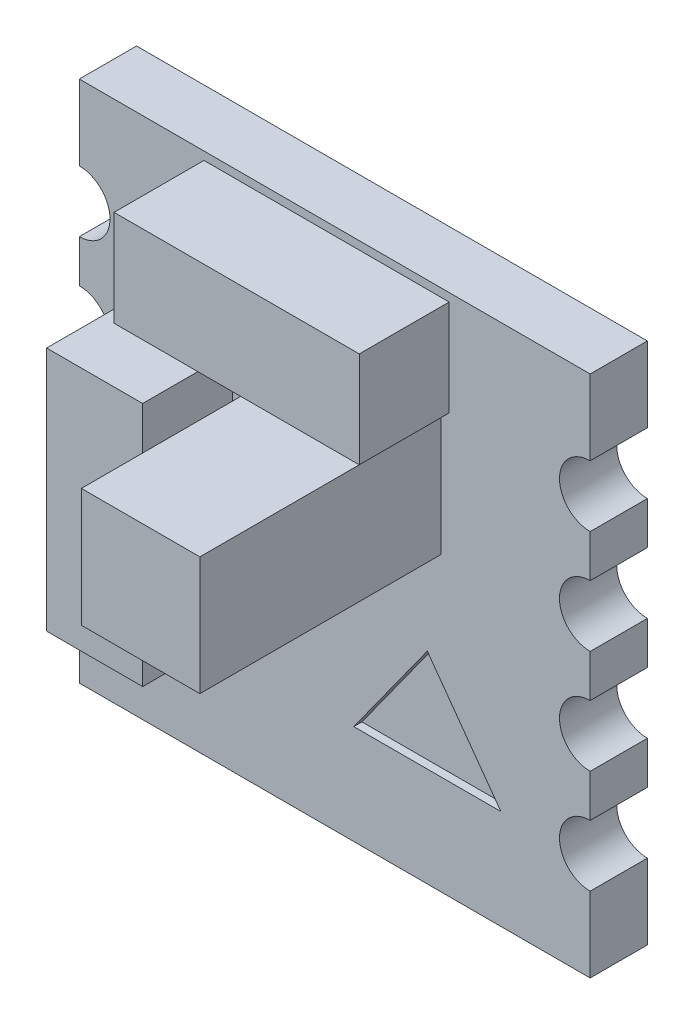
ISO-10303-21;
HEADER;
FILE_DESCRIPTION(('STEP AP214'),'2;1');
FILE_NAME('part.step','',(''),(''),'','','');
FILE_SCHEMA(('AUTOMOTIVE_DESIGN { 1 0 10303 214 1 1 1 1 }'));
ENDSEC;
DATA;
#1=APPLICATION_CONTEXT('core data for automotive mechanical design processes');
#2=APPLICATION_PROTOCOL_DEFINITION('international standard','automotive_design',2000,#1);
#3=PRODUCT_CONTEXT('',#1,'mechanical');
#4=PRODUCT('Part','Part','',(#3));
#5=PRODUCT_RELATED_PRODUCT_CATEGORY('part','',(#4));
#6=PRODUCT_DEFINITION_FORMATION('','',#4);
#7=PRODUCT_DEFINITION_CONTEXT('part definition',#1,'design');
#8=PRODUCT_DEFINITION('design','',#6,#7);
#9=PRODUCT_DEFINITION_SHAPE('','',#8);
#10=(LENGTH_UNIT() NAMED_UNIT(*) SI_UNIT(.MILLI.,.METRE.));
#11=(NAMED_UNIT(*) PLANE_ANGLE_UNIT() SI_UNIT($,.RADIAN.));
#12=(NAMED_UNIT(*) SI_UNIT($,.STERADIAN.) SOLID_ANGLE_UNIT());
#13=UNCERTAINTY_MEASURE_WITH_UNIT(LENGTH_MEASURE(1.E-05),#10,'distance_accuracy_value','');
#14=(GEOMETRIC_REPRESENTATION_CONTEXT(3) GLOBAL_UNCERTAINTY_ASSIGNED_CONTEXT((#13)) GLOBAL_UNIT_ASSIGNED_CONTEXT((#10,
#11,#12)) REPRESENTATION_CONTEXT('',''));
#15=CARTESIAN_POINT('',(0.,0.,0.));
#16=DIRECTION('',(0.,0.,1.));
#17=DIRECTION('',(1.,0.,0.));
#18=AXIS2_PLACEMENT_3D('',#15,#16,#17);
#19=CARTESIAN_POINT('',(0.,0.,0.7));
#20=DIRECTION('',(0.,0.,1.));
#21=DIRECTION('',(1.,0.,0.));
#22=AXIS2_PLACEMENT_3D('',#19,#20,#21);
#23=PLANE('',#22);
#24=DIRECTION('',(1.,0.,0.));
#25=VECTOR('',#24,1.);
#26=CARTESIAN_POINT('',(0.,-3.96497068329436,0.7));
#27=LINE('',#26,#25);
#28=CARTESIAN_POINT('',(0.465361390122973,-3.96497068329436,0.7));
#29=VERTEX_POINT('',#28);
#30=CARTESIAN_POINT('',(4.06536139012297,-3.96497068329436,0.7));
#31=VERTEX_POINT('',#30);
#32=EDGE_CURVE('E55',#29,#31,#27,.T.);
#33=ORIENTED_EDGE('',*,*,#32,.F.);
#34=DIRECTION('',(-0.584304725845076,-0.811534341451494,0.));
#35=VECTOR('',#34,1.);
#36=CARTESIAN_POINT('',(2.18660450612152,-1.57435524440749,0.7));
#37=LINE('',#36,#35);
#38=CARTESIAN_POINT('',(2.26536139012297,-1.46497068329436,0.7));
#39=VERTEX_POINT('',#38);
#40=EDGE_CURVE('E284',#39,#29,#37,.T.);
#41=ORIENTED_EDGE('',*,*,#40,.F.);
#42=DIRECTION('',(0.584304725845076,-0.811534341451495,0.));
#43=VECTOR('',#42,1.);
#44=CARTESIAN_POINT('',(0.797275090984612,0.574038065508921,0.7));
#45=LINE('',#44,#43);
#46=EDGE_CURVE('E287',#39,#31,#45,.T.);
#47=ORIENTED_EDGE('',*,*,#46,.T.);
#48=EDGE_LOOP('',(#33,#41,#47));
#49=FACE_BOUND('',#48,.T.);
#50=DIRECTION('',(0.,1.,0.));
#51=VECTOR('',#50,1.);
#52=CARTESIAN_POINT('',(2.8,6.2,0.7));
#53=LINE('',#52,#51);
#54=CARTESIAN_POINT('',(2.8,3.85,0.7));
#55=VERTEX_POINT('',#54);
#56=CARTESIAN_POINT('',(2.8,6.2,0.7));
#57=VERTEX_POINT('',#56);
#58=EDGE_CURVE('E355',#55,#57,#53,.T.);
#59=ORIENTED_EDGE('',*,*,#58,.F.);
#60=DIRECTION('',(1.,0.,0.));
#61=VECTOR('',#60,1.);
#62=CARTESIAN_POINT('',(-3.2,3.85,0.7));
#63=LINE('',#62,#61);
#64=CARTESIAN_POINT('',(-3.2,3.85,0.7));
#65=VERTEX_POINT('',#64);
#66=EDGE_CURVE('E360',#65,#55,#63,.T.);
#67=ORIENTED_EDGE('',*,*,#66,.F.);
#68=DIRECTION('',(0.,-1.,0.));
#69=VECTOR('',#68,1.);
#70=CARTESIAN_POINT('',(-3.2,6.2,0.7));
#71=LINE('',#70,#69);
#72=CARTESIAN_POINT('',(-3.2,6.2,0.7));
#73=VERTEX_POINT('',#72);
#74=EDGE_CURVE('E372',#73,#65,#71,.T.);
#75=ORIENTED_EDGE('',*,*,#74,.F.);
#76=DIRECTION('',(-1.,0.,0.));
#77=VECTOR('',#76,1.);
#78=CARTESIAN_POINT('',(-3.2,6.2,0.7));
#79=LINE('',#78,#77);
#80=EDGE_CURVE('E369',#57,#73,#79,.T.);
#81=ORIENTED_EDGE('',*,*,#80,.F.);
#82=EDGE_LOOP('',(#59,#67,#75,#81));
#83=FACE_BOUND('',#82,.T.);
#84=CARTESIAN_POINT('',(-6.25,3.81,0.7));
#85=DIRECTION('',(0.,0.,1.));
#86=DIRECTION('',(1.,0.,0.));
#87=AXIS2_PLACEMENT_3D('',#84,#85,#86);
#88=CIRCLE('',#87,0.749999999999999);
#89=CARTESIAN_POINT('',(-6.25,3.06,0.7));
#90=VERTEX_POINT('',#89);
#91=CARTESIAN_POINT('',(-6.25,4.56,0.7));
#92=VERTEX_POINT('',#91);
#93=EDGE_CURVE('E398',#90,#92,#88,.T.);
#94=ORIENTED_EDGE('',*,*,#93,.F.);
#95=DIRECTION('',(0.,-1.,0.));
#96=VECTOR('',#95,1.);
#97=CARTESIAN_POINT('',(-6.25,6.4,0.7));
#98=LINE('',#97,#96);
#99=CARTESIAN_POINT('',(-6.25,2.02,0.7));
#100=VERTEX_POINT('',#99);
#101=EDGE_CURVE('E477',#90,#100,#98,.T.);
#102=ORIENTED_EDGE('',*,*,#101,.T.);
#103=CARTESIAN_POINT('',(-6.25,1.27,0.7));
#104=DIRECTION('',(0.,0.,1.));
#105=DIRECTION('',(1.,0.,0.));
#106=AXIS2_PLACEMENT_3D('',#103,#104,#105);
#107=CIRCLE('',#106,0.749999999999999);
#108=CARTESIAN_POINT('',(-6.25,0.520000000000001,0.7));
#109=VERTEX_POINT('',#108);
#110=EDGE_CURVE('E400',#109,#100,#107,.T.);
#111=ORIENTED_EDGE('',*,*,#110,.F.);
#112=CARTESIAN_POINT('',(-6.25,-0.520000000000004,0.7));
#113=VERTEX_POINT('',#112);
#114=EDGE_CURVE('E587',#109,#113,#98,.T.);
#115=ORIENTED_EDGE('',*,*,#114,.T.);
#116=CARTESIAN_POINT('',(-6.25,-1.27,0.7));
#117=DIRECTION('',(0.,0.,1.));
#118=DIRECTION('',(-1.,0.,0.));
#119=AXIS2_PLACEMENT_3D('',#116,#117,#118);
#120=CIRCLE('',#119,0.749999999999999);
#121=CARTESIAN_POINT('',(-6.25,-2.02,0.7));
#122=VERTEX_POINT('',#121);
#123=EDGE_CURVE('E402',#122,#113,#120,.T.);
#124=ORIENTED_EDGE('',*,*,#123,.F.);
#125=CARTESIAN_POINT('',(-6.25,-3.06,0.7));
#126=VERTEX_POINT('',#125);
#127=EDGE_CURVE('E589',#122,#126,#98,.T.);
#128=ORIENTED_EDGE('',*,*,#127,.T.);
#129=CARTESIAN_POINT('',(-6.24999999999999,-3.81,0.7));
#130=DIRECTION('',(0.,0.,1.));
#131=DIRECTION('',(-1.,0.,0.));
#132=AXIS2_PLACEMENT_3D('',#129,#130,#131);
#133=CIRCLE('',#132,0.749999999999999);
#134=CARTESIAN_POINT('',(-6.25,-4.56,0.7));
#135=VERTEX_POINT('',#134);
#136=EDGE_CURVE('E407',#135,#126,#133,.T.);
#137=ORIENTED_EDGE('',*,*,#136,.F.);
#138=CARTESIAN_POINT('',(-6.25,-6.4,0.7));
#139=VERTEX_POINT('',#138);
#140=EDGE_CURVE('E472',#135,#139,#98,.T.);
#141=ORIENTED_EDGE('',*,*,#140,.T.);
#142=DIRECTION('',(1.,0.,0.));
#143=VECTOR('',#142,1.);
#144=CARTESIAN_POINT('',(-6.25,-6.4,0.7));
#145=LINE('',#144,#143);
#146=CARTESIAN_POINT('',(6.25,-6.4,0.7));
#147=VERTEX_POINT('',#146);
#148=EDGE_CURVE('E476',#139,#147,#145,.T.);
#149=ORIENTED_EDGE('',*,*,#148,.T.);
#150=DIRECTION('',(0.,1.,0.));
#151=VECTOR('',#150,1.);
#152=CARTESIAN_POINT('',(6.25,6.4,0.7));
#153=LINE('',#152,#151);
#154=CARTESIAN_POINT('',(6.25,-4.56,0.7));
#155=VERTEX_POINT('',#154);
#156=EDGE_CURVE('E465',#147,#155,#153,.T.);
#157=ORIENTED_EDGE('',*,*,#156,.T.);
#158=CARTESIAN_POINT('',(6.24999999999999,-3.81,0.7));
#159=DIRECTION('',(0.,0.,1.));
#160=DIRECTION('',(1.,0.,0.));
#161=AXIS2_PLACEMENT_3D('',#158,#159,#160);
#162=CIRCLE('',#161,0.749999999999999);
#163=CARTESIAN_POINT('',(6.25,-3.06,0.7));
#164=VERTEX_POINT('',#163);
#165=EDGE_CURVE('E396',#164,#155,#162,.T.);
#166=ORIENTED_EDGE('',*,*,#165,.F.);
#167=CARTESIAN_POINT('',(6.25,-2.02,0.7));
#168=VERTEX_POINT('',#167);
#169=EDGE_CURVE('E469',#164,#168,#153,.T.);
#170=ORIENTED_EDGE('',*,*,#169,.T.);
#171=CARTESIAN_POINT('',(6.25,-1.27,0.7));
#172=DIRECTION('',(0.,0.,1.));
#173=DIRECTION('',(1.,0.,0.));
#174=AXIS2_PLACEMENT_3D('',#171,#172,#173);
#175=CIRCLE('',#174,0.749999999999999);
#176=CARTESIAN_POINT('',(6.25,-0.520000000000004,0.7));
#177=VERTEX_POINT('',#176);
#178=EDGE_CURVE('E391',#177,#168,#175,.T.);
#179=ORIENTED_EDGE('',*,*,#178,.F.);
#180=CARTESIAN_POINT('',(6.25,0.520000000000001,0.7));
#181=VERTEX_POINT('',#180);
#182=EDGE_CURVE('E543',#177,#181,#153,.T.);
#183=ORIENTED_EDGE('',*,*,#182,.T.);
#184=CARTESIAN_POINT('',(6.25,1.27,0.7));
#185=DIRECTION('',(0.,0.,1.));
#186=DIRECTION('',(-1.,0.,0.));
#187=AXIS2_PLACEMENT_3D('',#184,#185,#186);
#188=CIRCLE('',#187,0.749999999999999);
#189=CARTESIAN_POINT('',(6.25,2.02,0.7));
#190=VERTEX_POINT('',#189);
#191=EDGE_CURVE('E388',#190,#181,#188,.T.);
#192=ORIENTED_EDGE('',*,*,#191,.F.);
#193=CARTESIAN_POINT('',(6.25,3.06,0.7));
#194=VERTEX_POINT('',#193);
#195=EDGE_CURVE('E542',#190,#194,#153,.T.);
#196=ORIENTED_EDGE('',*,*,#195,.T.);
#197=CARTESIAN_POINT('',(6.25,3.81,0.7));
#198=DIRECTION('',(0.,0.,1.));
#199=DIRECTION('',(-1.,0.,0.));
#200=AXIS2_PLACEMENT_3D('',#197,#198,#199);
#201=CIRCLE('',#200,0.749999999999999);
#202=CARTESIAN_POINT('',(6.25,4.56,0.7));
#203=VERTEX_POINT('',#202);
#204=EDGE_CURVE('E390',#203,#194,#201,.T.);
#205=ORIENTED_EDGE('',*,*,#204,.F.);
#206=CARTESIAN_POINT('',(6.25,6.4,0.7));
#207=VERTEX_POINT('',#206);
#208=EDGE_CURVE('E470',#203,#207,#153,.T.);
#209=ORIENTED_EDGE('',*,*,#208,.T.);
#210=DIRECTION('',(-1.,0.,0.));
#211=VECTOR('',#210,1.);
#212=CARTESIAN_POINT('',(-6.25,6.4,0.7));
#213=LINE('',#212,#211);
#214=CARTESIAN_POINT('',(-6.25,6.4,0.7));
#215=VERTEX_POINT('',#214);
#216=EDGE_CURVE('E468',#207,#215,#213,.T.);
#217=ORIENTED_EDGE('',*,*,#216,.T.);
#218=EDGE_CURVE('E473',#215,#92,#98,.T.);
#219=ORIENTED_EDGE('',*,*,#218,.T.);
#220=EDGE_LOOP('',(#94,#102,#111,#115,#124,#128,#137,#141,#149,#157,#166,#170,#179,#183,#192,
#196,#205,#209,#217,#219));
#221=FACE_BOUND('',#220,.T.);
#222=DIRECTION('',(-1.,0.,0.));
#223=VECTOR('',#222,1.);
#224=CARTESIAN_POINT('',(-4.85,2.5,0.7));
#225=LINE('',#224,#223);
#226=CARTESIAN_POINT('',(-2.5,2.5,0.7));
#227=VERTEX_POINT('',#226);
#228=CARTESIAN_POINT('',(-4.85,2.5,0.7));
#229=VERTEX_POINT('',#228);
#230=EDGE_CURVE('E340',#227,#229,#225,.T.);
#231=ORIENTED_EDGE('',*,*,#230,.F.);
#232=DIRECTION('',(0.,1.,0.));
#233=VECTOR('',#232,1.);
#234=CARTESIAN_POINT('',(-2.5,2.5,0.7));
#235=LINE('',#234,#233);
#236=CARTESIAN_POINT('',(-2.5,-3.5,0.7));
#237=VERTEX_POINT('',#236);
#238=EDGE_CURVE('E314',#237,#227,#235,.T.);
#239=ORIENTED_EDGE('',*,*,#238,.F.);
#240=DIRECTION('',(1.,0.,0.));
#241=VECTOR('',#240,1.);
#242=CARTESIAN_POINT('',(-4.85,-3.5,0.7));
#243=LINE('',#242,#241);
#244=CARTESIAN_POINT('',(-4.85,-3.5,0.7));
#245=VERTEX_POINT('',#244);
#246=EDGE_CURVE('E331',#245,#237,#243,.T.);
#247=ORIENTED_EDGE('',*,*,#246,.F.);
#248=DIRECTION('',(0.,-1.,0.));
#249=VECTOR('',#248,1.);
#250=CARTESIAN_POINT('',(-4.85,2.5,0.7));
#251=LINE('',#250,#249);
#252=EDGE_CURVE('E342',#229,#245,#251,.T.);
#253=ORIENTED_EDGE('',*,*,#252,.F.);
#254=EDGE_LOOP('',(#231,#239,#247,#253));
#255=FACE_BOUND('',#254,.T.);
#256=DIRECTION('',(-1.,0.,0.));
#257=VECTOR('',#256,1.);
#258=CARTESIAN_POINT('',(-0.299999999999999,3.65,0.7));
#259=LINE('',#258,#257);
#260=CARTESIAN_POINT('',(2.6,3.65,0.7));
#261=VERTEX_POINT('',#260);
#262=CARTESIAN_POINT('',(-0.299999999999999,3.65,0.7));
#263=VERTEX_POINT('',#262);
#264=EDGE_CURVE('E304',#261,#263,#259,.T.);
#265=ORIENTED_EDGE('',*,*,#264,.F.);
#266=DIRECTION('',(0.,1.,0.));
#267=VECTOR('',#266,1.);
#268=CARTESIAN_POINT('',(2.6,3.65,0.7));
#269=LINE('',#268,#267);
#270=CARTESIAN_POINT('',(2.6,0.749999999999999,0.7));
#271=VERTEX_POINT('',#270);
#272=EDGE_CURVE('E308',#271,#261,#269,.T.);
#273=ORIENTED_EDGE('',*,*,#272,.F.);
#274=DIRECTION('',(1.,0.,0.));
#275=VECTOR('',#274,1.);
#276=CARTESIAN_POINT('',(-0.299999999999998,0.749999999999999,0.7));
#277=LINE('',#276,#275);
#278=CARTESIAN_POINT('',(-0.299999999999998,0.749999999999999,0.7));
#279=VERTEX_POINT('',#278);
#280=EDGE_CURVE('E297',#279,#271,#277,.T.);
#281=ORIENTED_EDGE('',*,*,#280,.F.);
#282=DIRECTION('',(0.,-1.,0.));
#283=VECTOR('',#282,1.);
#284=CARTESIAN_POINT('',(-0.299999999999999,3.65,0.7));
#285=LINE('',#284,#283);
#286=EDGE_CURVE('E63',#263,#279,#285,.T.);
#287=ORIENTED_EDGE('',*,*,#286,.F.);
#288=EDGE_LOOP('',(#265,#273,#281,#287));
#289=FACE_BOUND('',#288,.T.);
#290=ADVANCED_FACE('F40',(#49,#83,#221,#255,#289),#23,.T.);
#291=CARTESIAN_POINT('',(6.25,6.4,0.7));
#292=DIRECTION('',(-1.,0.,0.));
#293=DIRECTION('',(0.,-1.,0.));
#294=AXIS2_PLACEMENT_3D('',#291,#292,#293);
#295=PLANE('',#294);
#296=DIRECTION('',(0.,1.,0.));
#297=VECTOR('',#296,1.);
#298=CARTESIAN_POINT('',(6.25,6.4,-0.7));
#299=LINE('',#298,#297);
#300=CARTESIAN_POINT('',(6.25,-6.4,-0.7));
#301=VERTEX_POINT('',#300);
#302=CARTESIAN_POINT('',(6.25,-4.56,-0.7));
#303=VERTEX_POINT('',#302);
#304=EDGE_CURVE('E480',#301,#303,#299,.T.);
#305=ORIENTED_EDGE('',*,*,#304,.T.);
#306=DIRECTION('',(0.,0.,1.));
#307=VECTOR('',#306,1.);
#308=CARTESIAN_POINT('',(6.25,-4.56,-0.7));
#309=LINE('',#308,#307);
#310=EDGE_CURVE('E443',#303,#155,#309,.T.);
#311=ORIENTED_EDGE('',*,*,#310,.T.);
#312=ORIENTED_EDGE('',*,*,#156,.F.);
#313=DIRECTION('',(0.,0.,-1.));
#314=VECTOR('',#313,1.);
#315=CARTESIAN_POINT('',(6.25,-6.4,0.7));
#316=LINE('',#315,#314);
#317=EDGE_CURVE('E479',#147,#301,#316,.T.);
#318=ORIENTED_EDGE('',*,*,#317,.T.);
#319=EDGE_LOOP('',(#305,#311,#312,#318));
#320=FACE_BOUND('',#319,.T.);
#321=ADVANCED_FACE('F559',(#320),#295,.F.);
#322=CARTESIAN_POINT('',(6.25,-0.520000000000004,-0.7));
#323=VERTEX_POINT('',#322);
#324=CARTESIAN_POINT('',(6.25,0.520000000000001,-0.7));
#325=VERTEX_POINT('',#324);
#326=EDGE_CURVE('E516',#323,#325,#299,.T.);
#327=ORIENTED_EDGE('',*,*,#326,.T.);
#328=DIRECTION('',(0.,0.,1.));
#329=VECTOR('',#328,1.);
#330=CARTESIAN_POINT('',(6.25,0.520000000000001,-0.7));
#331=LINE('',#330,#329);
#332=EDGE_CURVE('E437',#325,#181,#331,.T.);
#333=ORIENTED_EDGE('',*,*,#332,.T.);
#334=ORIENTED_EDGE('',*,*,#182,.F.);
#335=DIRECTION('',(0.,0.,1.));
#336=VECTOR('',#335,1.);
#337=CARTESIAN_POINT('',(6.25,-0.520000000000004,-0.7));
#338=LINE('',#337,#336);
#339=EDGE_CURVE('E422',#177,#323,#338,.F.);
#340=ORIENTED_EDGE('',*,*,#339,.T.);
#341=EDGE_LOOP('',(#327,#333,#334,#340));
#342=FACE_BOUND('',#341,.T.);
#343=ADVANCED_FACE('F521',(#342),#295,.F.);
#344=ORIENTED_EDGE('',*,*,#195,.F.);
#345=DIRECTION('',(0.,0.,1.));
#346=VECTOR('',#345,1.);
#347=CARTESIAN_POINT('',(6.25,2.02,-0.7));
#348=LINE('',#347,#346);
#349=CARTESIAN_POINT('',(6.25,2.02,-0.7));
#350=VERTEX_POINT('',#349);
#351=EDGE_CURVE('E434',#190,#350,#348,.F.);
#352=ORIENTED_EDGE('',*,*,#351,.T.);
#353=CARTESIAN_POINT('',(6.25,3.06,-0.7));
#354=VERTEX_POINT('',#353);
#355=EDGE_CURVE('E518',#350,#354,#299,.T.);
#356=ORIENTED_EDGE('',*,*,#355,.T.);
#357=DIRECTION('',(0.,0.,1.));
#358=VECTOR('',#357,1.);
#359=CARTESIAN_POINT('',(6.25,3.06,-0.7));
#360=LINE('',#359,#358);
#361=EDGE_CURVE('E431',#354,#194,#360,.T.);
#362=ORIENTED_EDGE('',*,*,#361,.T.);
#363=EDGE_LOOP('',(#344,#352,#356,#362));
#364=FACE_BOUND('',#363,.T.);
#365=ADVANCED_FACE('F719',(#364),#295,.F.);
#366=ORIENTED_EDGE('',*,*,#169,.F.);
#367=DIRECTION('',(0.,0.,1.));
#368=VECTOR('',#367,1.);
#369=CARTESIAN_POINT('',(6.25,-3.06,-0.7));
#370=LINE('',#369,#368);
#371=CARTESIAN_POINT('',(6.25,-3.06,-0.7));
#372=VERTEX_POINT('',#371);
#373=EDGE_CURVE('E440',#164,#372,#370,.F.);
#374=ORIENTED_EDGE('',*,*,#373,.T.);
#375=CARTESIAN_POINT('',(6.25,-2.02,-0.7));
#376=VERTEX_POINT('',#375);
#377=EDGE_CURVE('E484',#372,#376,#299,.T.);
#378=ORIENTED_EDGE('',*,*,#377,.T.);
#379=DIRECTION('',(0.,0.,1.));
#380=VECTOR('',#379,1.);
#381=CARTESIAN_POINT('',(6.25,-2.02,-0.7));
#382=LINE('',#381,#380);
#383=EDGE_CURVE('E425',#376,#168,#382,.T.);
#384=ORIENTED_EDGE('',*,*,#383,.T.);
#385=EDGE_LOOP('',(#366,#374,#378,#384));
#386=FACE_BOUND('',#385,.T.);
#387=ADVANCED_FACE('F551',(#386),#295,.F.);
#388=CARTESIAN_POINT('',(-6.25,6.4,0.7));
#389=DIRECTION('',(1.,0.,0.));
#390=DIRECTION('',(0.,1.,0.));
#391=AXIS2_PLACEMENT_3D('',#388,#389,#390);
#392=PLANE('',#391);
#393=DIRECTION('',(0.,-1.,0.));
#394=VECTOR('',#393,1.);
#395=CARTESIAN_POINT('',(-6.25,6.4,-0.7));
#396=LINE('',#395,#394);
#397=CARTESIAN_POINT('',(-6.25,6.4,-0.7));
#398=VERTEX_POINT('',#397);
#399=CARTESIAN_POINT('',(-6.25,4.56,-0.7));
#400=VERTEX_POINT('',#399);
#401=EDGE_CURVE('E487',#398,#400,#396,.T.);
#402=ORIENTED_EDGE('',*,*,#401,.T.);
#403=DIRECTION('',(0.,0.,1.));
#404=VECTOR('',#403,1.);
#405=CARTESIAN_POINT('',(-6.25,4.56,-0.7));
#406=LINE('',#405,#404);
#407=EDGE_CURVE('E461',#400,#92,#406,.T.);
#408=ORIENTED_EDGE('',*,*,#407,.T.);
#409=ORIENTED_EDGE('',*,*,#218,.F.);
#410=DIRECTION('',(0.,0.,-1.));
#411=VECTOR('',#410,1.);
#412=CARTESIAN_POINT('',(-6.25,6.4,0.7));
#413=LINE('',#412,#411);
#414=EDGE_CURVE('E498',#215,#398,#413,.T.);
#415=ORIENTED_EDGE('',*,*,#414,.T.);
#416=EDGE_LOOP('',(#402,#408,#409,#415));
#417=FACE_BOUND('',#416,.T.);
#418=ADVANCED_FACE('F597',(#417),#392,.F.);
#419=CARTESIAN_POINT('',(-6.25,0.520000000000001,-0.7));
#420=VERTEX_POINT('',#419);
#421=CARTESIAN_POINT('',(-6.25,-0.520000000000004,-0.7));
#422=VERTEX_POINT('',#421);
#423=EDGE_CURVE('E571',#420,#422,#396,.T.);
#424=ORIENTED_EDGE('',*,*,#423,.T.);
#425=DIRECTION('',(0.,0.,1.));
#426=VECTOR('',#425,1.);
#427=CARTESIAN_POINT('',(-6.25,-0.520000000000004,-0.7));
#428=LINE('',#427,#426);
#429=EDGE_CURVE('E455',#422,#113,#428,.T.);
#430=ORIENTED_EDGE('',*,*,#429,.T.);
#431=ORIENTED_EDGE('',*,*,#114,.F.);
#432=DIRECTION('',(0.,0.,1.));
#433=VECTOR('',#432,1.);
#434=CARTESIAN_POINT('',(-6.25,0.520000000000001,-0.7));
#435=LINE('',#434,#433);
#436=EDGE_CURVE('E416',#109,#420,#435,.F.);
#437=ORIENTED_EDGE('',*,*,#436,.T.);
#438=EDGE_LOOP('',(#424,#430,#431,#437));
#439=FACE_BOUND('',#438,.T.);
#440=ADVANCED_FACE('F585',(#439),#392,.F.);
#441=ORIENTED_EDGE('',*,*,#127,.F.);
#442=DIRECTION('',(0.,0.,1.));
#443=VECTOR('',#442,1.);
#444=CARTESIAN_POINT('',(-6.25,-2.02,-0.7));
#445=LINE('',#444,#443);
#446=CARTESIAN_POINT('',(-6.25,-2.02,-0.7));
#447=VERTEX_POINT('',#446);
#448=EDGE_CURVE('E452',#122,#447,#445,.F.);
#449=ORIENTED_EDGE('',*,*,#448,.T.);
#450=CARTESIAN_POINT('',(-6.25,-3.06,-0.7));
#451=VERTEX_POINT('',#450);
#452=EDGE_CURVE('E570',#447,#451,#396,.T.);
#453=ORIENTED_EDGE('',*,*,#452,.T.);
#454=DIRECTION('',(0.,0.,1.));
#455=VECTOR('',#454,1.);
#456=CARTESIAN_POINT('',(-6.25,-3.06,-0.7));
#457=LINE('',#456,#455);
#458=EDGE_CURVE('E449',#451,#126,#457,.T.);
#459=ORIENTED_EDGE('',*,*,#458,.T.);
#460=EDGE_LOOP('',(#441,#449,#453,#459));
#461=FACE_BOUND('',#460,.T.);
#462=ADVANCED_FACE('F606',(#461),#392,.F.);
#463=ORIENTED_EDGE('',*,*,#101,.F.);
#464=DIRECTION('',(0.,0.,1.));
#465=VECTOR('',#464,1.);
#466=CARTESIAN_POINT('',(-6.25,3.06,-0.7));
#467=LINE('',#466,#465);
#468=CARTESIAN_POINT('',(-6.25,3.06,-0.7));
#469=VERTEX_POINT('',#468);
#470=EDGE_CURVE('E458',#90,#469,#467,.F.);
#471=ORIENTED_EDGE('',*,*,#470,.T.);
#472=CARTESIAN_POINT('',(-6.25,2.02,-0.7));
#473=VERTEX_POINT('',#472);
#474=EDGE_CURVE('E491',#469,#473,#396,.T.);
#475=ORIENTED_EDGE('',*,*,#474,.T.);
#476=DIRECTION('',(0.,0.,1.));
#477=VECTOR('',#476,1.);
#478=CARTESIAN_POINT('',(-6.25,2.02,-0.7));
#479=LINE('',#478,#477);
#480=EDGE_CURVE('E419',#473,#100,#479,.T.);
#481=ORIENTED_EDGE('',*,*,#480,.T.);
#482=EDGE_LOOP('',(#463,#471,#475,#481));
#483=FACE_BOUND('',#482,.T.);
#484=ADVANCED_FACE('F579',(#483),#392,.F.);
#485=ORIENTED_EDGE('',*,*,#208,.F.);
#486=DIRECTION('',(0.,0.,1.));
#487=VECTOR('',#486,1.);
#488=CARTESIAN_POINT('',(6.25,4.56,-0.7));
#489=LINE('',#488,#487);
#490=CARTESIAN_POINT('',(6.25,4.56,-0.7));
#491=VERTEX_POINT('',#490);
#492=EDGE_CURVE('E428',#203,#491,#489,.F.);
#493=ORIENTED_EDGE('',*,*,#492,.T.);
#494=CARTESIAN_POINT('',(6.25,6.4,-0.7));
#495=VERTEX_POINT('',#494);
#496=EDGE_CURVE('E464',#491,#495,#299,.T.);
#497=ORIENTED_EDGE('',*,*,#496,.T.);
#498=DIRECTION('',(0.,0.,-1.));
#499=VECTOR('',#498,1.);
#500=CARTESIAN_POINT('',(6.25,6.4,0.7));
#501=LINE('',#500,#499);
#502=EDGE_CURVE('E501',#207,#495,#501,.T.);
#503=ORIENTED_EDGE('',*,*,#502,.F.);
#504=EDGE_LOOP('',(#485,#493,#497,#503));
#505=FACE_BOUND('',#504,.T.);
#506=ADVANCED_FACE('F42',(#505),#295,.F.);
#507=CARTESIAN_POINT('',(-6.25,6.4,0.7));
#508=DIRECTION('',(0.,-1.,0.));
#509=DIRECTION('',(0.,0.,-1.));
#510=AXIS2_PLACEMENT_3D('',#507,#508,#509);
#511=PLANE('',#510);
#512=DIRECTION('',(-1.,0.,0.));
#513=VECTOR('',#512,1.);
#514=CARTESIAN_POINT('',(-6.25,6.4,-0.7));
#515=LINE('',#514,#513);
#516=EDGE_CURVE('E483',#495,#398,#515,.T.);
#517=ORIENTED_EDGE('',*,*,#516,.T.);
#518=ORIENTED_EDGE('',*,*,#414,.F.);
#519=ORIENTED_EDGE('',*,*,#216,.F.);
#520=ORIENTED_EDGE('',*,*,#502,.T.);
#521=EDGE_LOOP('',(#517,#518,#519,#520));
#522=FACE_BOUND('',#521,.T.);
#523=ADVANCED_FACE('F535',(#522),#511,.F.);
#524=ORIENTED_EDGE('',*,*,#140,.F.);
#525=DIRECTION('',(0.,0.,1.));
#526=VECTOR('',#525,1.);
#527=CARTESIAN_POINT('',(-6.25,-4.56,-0.7));
#528=LINE('',#527,#526);
#529=CARTESIAN_POINT('',(-6.25,-4.56,-0.7));
#530=VERTEX_POINT('',#529);
#531=EDGE_CURVE('E446',#135,#530,#528,.F.);
#532=ORIENTED_EDGE('',*,*,#531,.T.);
#533=CARTESIAN_POINT('',(-6.25,-6.4,-0.7));
#534=VERTEX_POINT('',#533);
#535=EDGE_CURVE('E486',#530,#534,#396,.T.);
#536=ORIENTED_EDGE('',*,*,#535,.T.);
#537=DIRECTION('',(0.,0.,-1.));
#538=VECTOR('',#537,1.);
#539=CARTESIAN_POINT('',(-6.25,-6.4,0.7));
#540=LINE('',#539,#538);
#541=EDGE_CURVE('E495',#139,#534,#540,.T.);
#542=ORIENTED_EDGE('',*,*,#541,.F.);
#543=EDGE_LOOP('',(#524,#532,#536,#542));
#544=FACE_BOUND('',#543,.T.);
#545=ADVANCED_FACE('F594',(#544),#392,.F.);
#546=CARTESIAN_POINT('',(-6.25,-6.4,0.7));
#547=DIRECTION('',(0.,1.,0.));
#548=DIRECTION('',(0.,0.,1.));
#549=AXIS2_PLACEMENT_3D('',#546,#547,#548);
#550=PLANE('',#549);
#551=DIRECTION('',(1.,0.,0.));
#552=VECTOR('',#551,1.);
#553=CARTESIAN_POINT('',(-6.25,-6.4,-0.7));
#554=LINE('',#553,#552);
#555=EDGE_CURVE('E490',#534,#301,#554,.T.);
#556=ORIENTED_EDGE('',*,*,#555,.T.);
#557=ORIENTED_EDGE('',*,*,#317,.F.);
#558=ORIENTED_EDGE('',*,*,#148,.F.);
#559=ORIENTED_EDGE('',*,*,#541,.T.);
#560=EDGE_LOOP('',(#556,#557,#558,#559));
#561=FACE_BOUND('',#560,.T.);
#562=ADVANCED_FACE('F564',(#561),#550,.F.);
#563=CARTESIAN_POINT('',(0.,0.,-0.7));
#564=DIRECTION('',(0.,0.,1.));
#565=DIRECTION('',(1.,0.,0.));
#566=AXIS2_PLACEMENT_3D('',#563,#564,#565);
#567=PLANE('',#566);
#568=ORIENTED_EDGE('',*,*,#474,.F.);
#569=CARTESIAN_POINT('',(-6.25,3.81,-0.7));
#570=DIRECTION('',(0.,0.,1.));
#571=DIRECTION('',(1.,0.,0.));
#572=AXIS2_PLACEMENT_3D('',#569,#570,#571);
#573=CIRCLE('',#572,0.749999999999999);
#574=EDGE_CURVE('E12',#469,#400,#573,.T.);
#575=ORIENTED_EDGE('',*,*,#574,.T.);
#576=ORIENTED_EDGE('',*,*,#401,.F.);
#577=ORIENTED_EDGE('',*,*,#516,.F.);
#578=ORIENTED_EDGE('',*,*,#496,.F.);
#579=CARTESIAN_POINT('',(6.25,3.81,-0.7));
#580=DIRECTION('',(0.,0.,1.));
#581=DIRECTION('',(1.,0.,0.));
#582=AXIS2_PLACEMENT_3D('',#579,#580,#581);
#583=CIRCLE('',#582,0.749999999999999);
#584=EDGE_CURVE('E507',#491,#354,#583,.T.);
#585=ORIENTED_EDGE('',*,*,#584,.T.);
#586=ORIENTED_EDGE('',*,*,#355,.F.);
#587=CARTESIAN_POINT('',(6.25,1.27,-0.7));
#588=DIRECTION('',(0.,0.,1.));
#589=DIRECTION('',(1.,0.,0.));
#590=AXIS2_PLACEMENT_3D('',#587,#588,#589);
#591=CIRCLE('',#590,0.749999999999999);
#592=EDGE_CURVE('E48',#350,#325,#591,.T.);
#593=ORIENTED_EDGE('',*,*,#592,.T.);
#594=ORIENTED_EDGE('',*,*,#326,.F.);
#595=CARTESIAN_POINT('',(6.25,-1.27,-0.7));
#596=DIRECTION('',(0.,0.,1.));
#597=DIRECTION('',(1.,0.,0.));
#598=AXIS2_PLACEMENT_3D('',#595,#596,#597);
#599=CIRCLE('',#598,0.749999999999999);
#600=EDGE_CURVE('E393',#323,#376,#599,.T.);
#601=ORIENTED_EDGE('',*,*,#600,.T.);
#602=ORIENTED_EDGE('',*,*,#377,.F.);
#603=CARTESIAN_POINT('',(6.24999999999999,-3.81,-0.7));
#604=DIRECTION('',(0.,0.,1.));
#605=DIRECTION('',(1.,0.,0.));
#606=AXIS2_PLACEMENT_3D('',#603,#604,#605);
#607=CIRCLE('',#606,0.749999999999999);
#608=EDGE_CURVE('E409',#372,#303,#607,.T.);
#609=ORIENTED_EDGE('',*,*,#608,.T.);
#610=ORIENTED_EDGE('',*,*,#304,.F.);
#611=ORIENTED_EDGE('',*,*,#555,.F.);
#612=ORIENTED_EDGE('',*,*,#535,.F.);
#613=CARTESIAN_POINT('',(-6.24999999999999,-3.81,-0.7));
#614=DIRECTION('',(0.,0.,1.));
#615=DIRECTION('',(-1.,0.,0.));
#616=AXIS2_PLACEMENT_3D('',#613,#614,#615);
#617=CIRCLE('',#616,0.749999999999999);
#618=EDGE_CURVE('E404',#530,#451,#617,.T.);
#619=ORIENTED_EDGE('',*,*,#618,.T.);
#620=ORIENTED_EDGE('',*,*,#452,.F.);
#621=CARTESIAN_POINT('',(-6.25,-1.27,-0.7));
#622=DIRECTION('',(0.,0.,1.));
#623=DIRECTION('',(-1.,0.,0.));
#624=AXIS2_PLACEMENT_3D('',#621,#622,#623);
#625=CIRCLE('',#624,0.749999999999999);
#626=EDGE_CURVE('E401',#447,#422,#625,.T.);
#627=ORIENTED_EDGE('',*,*,#626,.T.);
#628=ORIENTED_EDGE('',*,*,#423,.F.);
#629=CARTESIAN_POINT('',(-6.25,1.27,-0.7));
#630=DIRECTION('',(0.,0.,1.));
#631=DIRECTION('',(1.,0.,0.));
#632=AXIS2_PLACEMENT_3D('',#629,#630,#631);
#633=CIRCLE('',#632,0.749999999999999);
#634=EDGE_CURVE('E504',#420,#473,#633,.T.);
#635=ORIENTED_EDGE('',*,*,#634,.T.);
#636=EDGE_LOOP('',(#568,#575,#576,#577,#578,#585,#586,#593,#594,#601,#602,#609,#610,#611,#612,
#619,#620,#627,#628,#635));
#637=FACE_BOUND('',#636,.T.);
#638=ADVANCED_FACE('F515',(#637),#567,.F.);
#639=CARTESIAN_POINT('',(-6.25,1.27,-0.7));
#640=DIRECTION('',(0.,0.,1.));
#641=DIRECTION('',(1.,0.,0.));
#642=AXIS2_PLACEMENT_3D('',#639,#640,#641);
#643=CYLINDRICAL_SURFACE('',#642,0.749999999999999);
#644=ORIENTED_EDGE('',*,*,#634,.F.);
#645=ORIENTED_EDGE('',*,*,#436,.F.);
#646=ORIENTED_EDGE('',*,*,#110,.T.);
#647=ORIENTED_EDGE('',*,*,#480,.F.);
#648=EDGE_LOOP('',(#644,#645,#646,#647));
#649=FACE_BOUND('',#648,.T.);
#650=ADVANCED_FACE('F582',(#649),#643,.F.);
#651=CARTESIAN_POINT('',(6.25,-1.27,-0.7));
#652=DIRECTION('',(0.,0.,1.));
#653=DIRECTION('',(1.,0.,0.));
#654=AXIS2_PLACEMENT_3D('',#651,#652,#653);
#655=CYLINDRICAL_SURFACE('',#654,0.749999999999999);
#656=ORIENTED_EDGE('',*,*,#600,.F.);
#657=ORIENTED_EDGE('',*,*,#339,.F.);
#658=ORIENTED_EDGE('',*,*,#178,.T.);
#659=ORIENTED_EDGE('',*,*,#383,.F.);
#660=EDGE_LOOP('',(#656,#657,#658,#659));
#661=FACE_BOUND('',#660,.T.);
#662=ADVANCED_FACE('F554',(#661),#655,.F.);
#663=CARTESIAN_POINT('',(6.25,3.81,-0.7));
#664=DIRECTION('',(0.,0.,1.));
#665=DIRECTION('',(1.,0.,0.));
#666=AXIS2_PLACEMENT_3D('',#663,#664,#665);
#667=CYLINDRICAL_SURFACE('',#666,0.749999999999999);
#668=ORIENTED_EDGE('',*,*,#584,.F.);
#669=ORIENTED_EDGE('',*,*,#492,.F.);
#670=ORIENTED_EDGE('',*,*,#204,.T.);
#671=ORIENTED_EDGE('',*,*,#361,.F.);
#672=EDGE_LOOP('',(#668,#669,#670,#671));
#673=FACE_BOUND('',#672,.T.);
#674=ADVANCED_FACE('F624',(#673),#667,.F.);
#675=CARTESIAN_POINT('',(6.25,1.27,-0.7));
#676=DIRECTION('',(0.,0.,1.));
#677=DIRECTION('',(1.,0.,0.));
#678=AXIS2_PLACEMENT_3D('',#675,#676,#677);
#679=CYLINDRICAL_SURFACE('',#678,0.749999999999999);
#680=ORIENTED_EDGE('',*,*,#592,.F.);
#681=ORIENTED_EDGE('',*,*,#351,.F.);
#682=ORIENTED_EDGE('',*,*,#191,.T.);
#683=ORIENTED_EDGE('',*,*,#332,.F.);
#684=EDGE_LOOP('',(#680,#681,#682,#683));
#685=FACE_BOUND('',#684,.T.);
#686=ADVANCED_FACE('F629',(#685),#679,.F.);
#687=CARTESIAN_POINT('',(6.24999999999999,-3.81,-0.7));
#688=DIRECTION('',(0.,0.,1.));
#689=DIRECTION('',(1.,0.,0.));
#690=AXIS2_PLACEMENT_3D('',#687,#688,#689);
#691=CYLINDRICAL_SURFACE('',#690,0.749999999999999);
#692=ORIENTED_EDGE('',*,*,#608,.F.);
#693=ORIENTED_EDGE('',*,*,#373,.F.);
#694=ORIENTED_EDGE('',*,*,#165,.T.);
#695=ORIENTED_EDGE('',*,*,#310,.F.);
#696=EDGE_LOOP('',(#692,#693,#694,#695));
#697=FACE_BOUND('',#696,.T.);
#698=ADVANCED_FACE('F646',(#697),#691,.F.);
#699=CARTESIAN_POINT('',(-6.24999999999999,-3.81,-0.7));
#700=DIRECTION('',(0.,0.,1.));
#701=DIRECTION('',(1.,0.,0.));
#702=AXIS2_PLACEMENT_3D('',#699,#700,#701);
#703=CYLINDRICAL_SURFACE('',#702,0.749999999999999);
#704=ORIENTED_EDGE('',*,*,#618,.F.);
#705=ORIENTED_EDGE('',*,*,#531,.F.);
#706=ORIENTED_EDGE('',*,*,#136,.T.);
#707=ORIENTED_EDGE('',*,*,#458,.F.);
#708=EDGE_LOOP('',(#704,#705,#706,#707));
#709=FACE_BOUND('',#708,.T.);
#710=ADVANCED_FACE('F643',(#709),#703,.F.);
#711=CARTESIAN_POINT('',(-6.25,-1.27,-0.7));
#712=DIRECTION('',(0.,0.,1.));
#713=DIRECTION('',(1.,0.,0.));
#714=AXIS2_PLACEMENT_3D('',#711,#712,#713);
#715=CYLINDRICAL_SURFACE('',#714,0.749999999999999);
#716=ORIENTED_EDGE('',*,*,#626,.F.);
#717=ORIENTED_EDGE('',*,*,#448,.F.);
#718=ORIENTED_EDGE('',*,*,#123,.T.);
#719=ORIENTED_EDGE('',*,*,#429,.F.);
#720=EDGE_LOOP('',(#716,#717,#718,#719));
#721=FACE_BOUND('',#720,.T.);
#722=ADVANCED_FACE('F639',(#721),#715,.F.);
#723=CARTESIAN_POINT('',(-6.25,3.81,-0.7));
#724=DIRECTION('',(0.,0.,1.));
#725=DIRECTION('',(1.,0.,0.));
#726=AXIS2_PLACEMENT_3D('',#723,#724,#725);
#727=CYLINDRICAL_SURFACE('',#726,0.749999999999999);
#728=ORIENTED_EDGE('',*,*,#574,.F.);
#729=ORIENTED_EDGE('',*,*,#470,.F.);
#730=ORIENTED_EDGE('',*,*,#93,.T.);
#731=ORIENTED_EDGE('',*,*,#407,.F.);
#732=EDGE_LOOP('',(#728,#729,#730,#731));
#733=FACE_BOUND('',#732,.T.);
#734=ADVANCED_FACE('F635',(#733),#727,.F.);
#735=CARTESIAN_POINT('',(2.8,6.2,2.9));
#736=DIRECTION('',(-1.,0.,0.));
#737=DIRECTION('',(0.,-1.,0.));
#738=AXIS2_PLACEMENT_3D('',#735,#736,#737);
#739=PLANE('',#738);
#740=ORIENTED_EDGE('',*,*,#58,.T.);
#741=DIRECTION('',(0.,0.,-1.));
#742=VECTOR('',#741,1.);
#743=CARTESIAN_POINT('',(2.8,6.2,2.9));
#744=LINE('',#743,#742);
#745=CARTESIAN_POINT('',(2.8,6.2,2.9));
#746=VERTEX_POINT('',#745);
#747=EDGE_CURVE('E385',#746,#57,#744,.T.);
#748=ORIENTED_EDGE('',*,*,#747,.F.);
#749=DIRECTION('',(0.,1.,0.));
#750=VECTOR('',#749,1.);
#751=CARTESIAN_POINT('',(2.8,6.2,2.9));
#752=LINE('',#751,#750);
#753=CARTESIAN_POINT('',(2.8,3.85,2.9));
#754=VERTEX_POINT('',#753);
#755=EDGE_CURVE('E356',#754,#746,#752,.T.);
#756=ORIENTED_EDGE('',*,*,#755,.F.);
#757=DIRECTION('',(0.,0.,-1.));
#758=VECTOR('',#757,1.);
#759=CARTESIAN_POINT('',(2.8,3.85,2.9));
#760=LINE('',#759,#758);
#761=EDGE_CURVE('E366',#754,#55,#760,.T.);
#762=ORIENTED_EDGE('',*,*,#761,.T.);
#763=EDGE_LOOP('',(#740,#748,#756,#762));
#764=FACE_BOUND('',#763,.T.);
#765=ADVANCED_FACE('F638',(#764),#739,.F.);
#766=CARTESIAN_POINT('',(-3.2,6.2,2.9));
#767=DIRECTION('',(0.,-1.,0.));
#768=DIRECTION('',(0.,0.,-1.));
#769=AXIS2_PLACEMENT_3D('',#766,#767,#768);
#770=PLANE('',#769);
#771=ORIENTED_EDGE('',*,*,#80,.T.);
#772=DIRECTION('',(0.,0.,-1.));
#773=VECTOR('',#772,1.);
#774=CARTESIAN_POINT('',(-3.2,6.2,2.9));
#775=LINE('',#774,#773);
#776=CARTESIAN_POINT('',(-3.2,6.2,2.9));
#777=VERTEX_POINT('',#776);
#778=EDGE_CURVE('E382',#777,#73,#775,.T.);
#779=ORIENTED_EDGE('',*,*,#778,.F.);
#780=DIRECTION('',(-1.,0.,0.));
#781=VECTOR('',#780,1.);
#782=CARTESIAN_POINT('',(-3.2,6.2,2.9));
#783=LINE('',#782,#781);
#784=EDGE_CURVE('E359',#746,#777,#783,.T.);
#785=ORIENTED_EDGE('',*,*,#784,.F.);
#786=ORIENTED_EDGE('',*,*,#747,.T.);
#787=EDGE_LOOP('',(#771,#779,#785,#786));
#788=FACE_BOUND('',#787,.T.);
#789=ADVANCED_FACE('F778',(#788),#770,.F.);
#790=CARTESIAN_POINT('',(-3.2,6.2,2.9));
#791=DIRECTION('',(1.,0.,0.));
#792=DIRECTION('',(0.,1.,0.));
#793=AXIS2_PLACEMENT_3D('',#790,#791,#792);
#794=PLANE('',#793);
#795=ORIENTED_EDGE('',*,*,#74,.T.);
#796=DIRECTION('',(0.,0.,-1.));
#797=VECTOR('',#796,1.);
#798=CARTESIAN_POINT('',(-3.2,3.85,2.9));
#799=LINE('',#798,#797);
#800=CARTESIAN_POINT('',(-3.2,3.85,2.9));
#801=VERTEX_POINT('',#800);
#802=EDGE_CURVE('E379',#801,#65,#799,.T.);
#803=ORIENTED_EDGE('',*,*,#802,.F.);
#804=DIRECTION('',(0.,-1.,0.));
#805=VECTOR('',#804,1.);
#806=CARTESIAN_POINT('',(-3.2,6.2,2.9));
#807=LINE('',#806,#805);
#808=EDGE_CURVE('E362',#777,#801,#807,.T.);
#809=ORIENTED_EDGE('',*,*,#808,.F.);
#810=ORIENTED_EDGE('',*,*,#778,.T.);
#811=EDGE_LOOP('',(#795,#803,#809,#810));
#812=FACE_BOUND('',#811,.T.);
#813=ADVANCED_FACE('F786',(#812),#794,.F.);
#814=CARTESIAN_POINT('',(-3.2,3.85,2.9));
#815=DIRECTION('',(0.,1.,0.));
#816=DIRECTION('',(0.,0.,1.));
#817=AXIS2_PLACEMENT_3D('',#814,#815,#816);
#818=PLANE('',#817);
#819=ORIENTED_EDGE('',*,*,#66,.T.);
#820=ORIENTED_EDGE('',*,*,#761,.F.);
#821=DIRECTION('',(1.,0.,0.));
#822=VECTOR('',#821,1.);
#823=CARTESIAN_POINT('',(-3.2,3.85,2.9));
#824=LINE('',#823,#822);
#825=EDGE_CURVE('E364',#801,#754,#824,.T.);
#826=ORIENTED_EDGE('',*,*,#825,.F.);
#827=ORIENTED_EDGE('',*,*,#802,.T.);
#828=EDGE_LOOP('',(#819,#820,#826,#827));
#829=FACE_BOUND('',#828,.T.);
#830=ADVANCED_FACE('F795',(#829),#818,.F.);
#831=CARTESIAN_POINT('',(0.,0.,2.9));
#832=DIRECTION('',(0.,0.,1.));
#833=DIRECTION('',(1.,0.,0.));
#834=AXIS2_PLACEMENT_3D('',#831,#832,#833);
#835=PLANE('',#834);
#836=ORIENTED_EDGE('',*,*,#755,.T.);
#837=ORIENTED_EDGE('',*,*,#784,.T.);
#838=ORIENTED_EDGE('',*,*,#808,.T.);
#839=ORIENTED_EDGE('',*,*,#825,.T.);
#840=EDGE_LOOP('',(#836,#837,#838,#839));
#841=FACE_BOUND('',#840,.T.);
#842=ADVANCED_FACE('F804',(#841),#835,.T.);
#843=CARTESIAN_POINT('',(-2.5,2.5,2.9));
#844=DIRECTION('',(-1.,0.,0.));
#845=DIRECTION('',(0.,-1.,0.));
#846=AXIS2_PLACEMENT_3D('',#843,#844,#845);
#847=PLANE('',#846);
#848=ORIENTED_EDGE('',*,*,#238,.T.);
#849=DIRECTION('',(0.,0.,-1.));
#850=VECTOR('',#849,1.);
#851=CARTESIAN_POINT('',(-2.5,2.5,2.9));
#852=LINE('',#851,#850);
#853=CARTESIAN_POINT('',(-2.5,2.5,2.9));
#854=VERTEX_POINT('',#853);
#855=EDGE_CURVE('E353',#854,#227,#852,.T.);
#856=ORIENTED_EDGE('',*,*,#855,.F.);
#857=DIRECTION('',(0.,1.,0.));
#858=VECTOR('',#857,1.);
#859=CARTESIAN_POINT('',(-2.5,2.5,2.9));
#860=LINE('',#859,#858);
#861=CARTESIAN_POINT('',(-2.5,-3.5,2.9));
#862=VERTEX_POINT('',#861);
#863=EDGE_CURVE('E327',#862,#854,#860,.T.);
#864=ORIENTED_EDGE('',*,*,#863,.F.);
#865=DIRECTION('',(0.,0.,-1.));
#866=VECTOR('',#865,1.);
#867=CARTESIAN_POINT('',(-2.5,-3.5,2.9));
#868=LINE('',#867,#866);
#869=EDGE_CURVE('E337',#862,#237,#868,.T.);
#870=ORIENTED_EDGE('',*,*,#869,.T.);
#871=EDGE_LOOP('',(#848,#856,#864,#870));
#872=FACE_BOUND('',#871,.T.);
#873=ADVANCED_FACE('F813',(#872),#847,.F.);
#874=CARTESIAN_POINT('',(-4.85,2.5,2.9));
#875=DIRECTION('',(0.,-1.,0.));
#876=DIRECTION('',(0.,0.,-1.));
#877=AXIS2_PLACEMENT_3D('',#874,#875,#876);
#878=PLANE('',#877);
#879=ORIENTED_EDGE('',*,*,#230,.T.);
#880=DIRECTION('',(0.,0.,-1.));
#881=VECTOR('',#880,1.);
#882=CARTESIAN_POINT('',(-4.85,2.5,2.9));
#883=LINE('',#882,#881);
#884=CARTESIAN_POINT('',(-4.85,2.5,2.9));
#885=VERTEX_POINT('',#884);
#886=EDGE_CURVE('E350',#885,#229,#883,.T.);
#887=ORIENTED_EDGE('',*,*,#886,.F.);
#888=DIRECTION('',(-1.,0.,0.));
#889=VECTOR('',#888,1.);
#890=CARTESIAN_POINT('',(-4.85,2.5,2.9));
#891=LINE('',#890,#889);
#892=EDGE_CURVE('E330',#854,#885,#891,.T.);
#893=ORIENTED_EDGE('',*,*,#892,.F.);
#894=ORIENTED_EDGE('',*,*,#855,.T.);
#895=EDGE_LOOP('',(#879,#887,#893,#894));
#896=FACE_BOUND('',#895,.T.);
#897=ADVANCED_FACE('F822',(#896),#878,.F.);
#898=CARTESIAN_POINT('',(-4.85,2.5,2.9));
#899=DIRECTION('',(1.,0.,0.));
#900=DIRECTION('',(0.,1.,0.));
#901=AXIS2_PLACEMENT_3D('',#898,#899,#900);
#902=PLANE('',#901);
#903=ORIENTED_EDGE('',*,*,#252,.T.);
#904=DIRECTION('',(0.,0.,-1.));
#905=VECTOR('',#904,1.);
#906=CARTESIAN_POINT('',(-4.85,-3.5,2.9));
#907=LINE('',#906,#905);
#908=CARTESIAN_POINT('',(-4.85,-3.5,2.9));
#909=VERTEX_POINT('',#908);
#910=EDGE_CURVE('E348',#909,#245,#907,.T.);
#911=ORIENTED_EDGE('',*,*,#910,.F.);
#912=DIRECTION('',(0.,-1.,0.));
#913=VECTOR('',#912,1.);
#914=CARTESIAN_POINT('',(-4.85,2.5,2.9));
#915=LINE('',#914,#913);
#916=EDGE_CURVE('E333',#885,#909,#915,.T.);
#917=ORIENTED_EDGE('',*,*,#916,.F.);
#918=ORIENTED_EDGE('',*,*,#886,.T.);
#919=EDGE_LOOP('',(#903,#911,#917,#918));
#920=FACE_BOUND('',#919,.T.);
#921=ADVANCED_FACE('F831',(#920),#902,.F.);
#922=CARTESIAN_POINT('',(-4.85,-3.5,2.9));
#923=DIRECTION('',(0.,1.,0.));
#924=DIRECTION('',(0.,0.,1.));
#925=AXIS2_PLACEMENT_3D('',#922,#923,#924);
#926=PLANE('',#925);
#927=ORIENTED_EDGE('',*,*,#246,.T.);
#928=ORIENTED_EDGE('',*,*,#869,.F.);
#929=DIRECTION('',(1.,0.,0.));
#930=VECTOR('',#929,1.);
#931=CARTESIAN_POINT('',(-4.85,-3.5,2.9));
#932=LINE('',#931,#930);
#933=EDGE_CURVE('E335',#909,#862,#932,.T.);
#934=ORIENTED_EDGE('',*,*,#933,.F.);
#935=ORIENTED_EDGE('',*,*,#910,.T.);
#936=EDGE_LOOP('',(#927,#928,#934,#935));
#937=FACE_BOUND('',#936,.T.);
#938=ADVANCED_FACE('F840',(#937),#926,.F.);
#939=CARTESIAN_POINT('',(0.,0.,2.9));
#940=DIRECTION('',(0.,0.,1.));
#941=DIRECTION('',(1.,0.,0.));
#942=AXIS2_PLACEMENT_3D('',#939,#940,#941);
#943=PLANE('',#942);
#944=ORIENTED_EDGE('',*,*,#863,.T.);
#945=ORIENTED_EDGE('',*,*,#892,.T.);
#946=ORIENTED_EDGE('',*,*,#916,.T.);
#947=ORIENTED_EDGE('',*,*,#933,.T.);
#948=EDGE_LOOP('',(#944,#945,#946,#947));
#949=FACE_BOUND('',#948,.T.);
#950=ADVANCED_FACE('F849',(#949),#943,.T.);
#951=CARTESIAN_POINT('',(2.6,3.65,18.001219330882));
#952=DIRECTION('',(-1.,0.,0.));
#953=DIRECTION('',(0.,0.,1.));
#954=AXIS2_PLACEMENT_3D('',#951,#952,#953);
#955=PLANE('',#954);
#956=DIRECTION('',(0.,1.,0.));
#957=VECTOR('',#956,1.);
#958=CARTESIAN_POINT('',(2.6,3.65,6.6));
#959=LINE('',#958,#957);
#960=CARTESIAN_POINT('',(2.6,0.749999999999999,6.6));
#961=VERTEX_POINT('',#960);
#962=CARTESIAN_POINT('',(2.6,3.65,6.6));
#963=VERTEX_POINT('',#962);
#964=EDGE_CURVE('E318',#961,#963,#959,.T.);
#965=ORIENTED_EDGE('',*,*,#964,.F.);
#966=DIRECTION('',(0.,0.,-1.));
#967=VECTOR('',#966,1.);
#968=CARTESIAN_POINT('',(2.6,0.749999999999999,18.001219330882));
#969=LINE('',#968,#967);
#970=EDGE_CURVE('E295',#961,#271,#969,.T.);
#971=ORIENTED_EDGE('',*,*,#970,.T.);
#972=ORIENTED_EDGE('',*,*,#272,.T.);
#973=DIRECTION('',(0.,0.,-1.));
#974=VECTOR('',#973,1.);
#975=CARTESIAN_POINT('',(2.6,3.65,18.001219330882));
#976=LINE('',#975,#974);
#977=EDGE_CURVE('E307',#963,#261,#976,.T.);
#978=ORIENTED_EDGE('',*,*,#977,.F.);
#979=EDGE_LOOP('',(#965,#971,#972,#978));
#980=FACE_BOUND('',#979,.T.);
#981=ADVANCED_FACE('F858',(#980),#955,.F.);
#982=CARTESIAN_POINT('',(-0.299999999999999,3.65,18.001219330882));
#983=DIRECTION('',(0.,-1.,0.));
#984=DIRECTION('',(1.,0.,0.));
#985=AXIS2_PLACEMENT_3D('',#982,#983,#984);
#986=PLANE('',#985);
#987=DIRECTION('',(-1.,0.,0.));
#988=VECTOR('',#987,1.);
#989=CARTESIAN_POINT('',(-0.299999999999999,3.65,6.6));
#990=LINE('',#989,#988);
#991=CARTESIAN_POINT('',(-0.299999999999999,3.65,6.6));
#992=VERTEX_POINT('',#991);
#993=EDGE_CURVE('E315',#963,#992,#990,.T.);
#994=ORIENTED_EDGE('',*,*,#993,.F.);
#995=ORIENTED_EDGE('',*,*,#977,.T.);
#996=ORIENTED_EDGE('',*,*,#264,.T.);
#997=DIRECTION('',(0.,0.,-1.));
#998=VECTOR('',#997,1.);
#999=CARTESIAN_POINT('',(-0.299999999999999,3.65,18.001219330882));
#1000=LINE('',#999,#998);
#1001=EDGE_CURVE('E303',#992,#263,#1000,.T.);
#1002=ORIENTED_EDGE('',*,*,#1001,.F.);
#1003=EDGE_LOOP('',(#994,#995,#996,#1002));
#1004=FACE_BOUND('',#1003,.T.);
#1005=ADVANCED_FACE('F873',(#1004),#986,.F.);
#1006=CARTESIAN_POINT('',(-0.299999999999999,3.65,18.001219330882));
#1007=DIRECTION('',(1.,0.,0.));
#1008=DIRECTION('',(0.,1.,0.));
#1009=AXIS2_PLACEMENT_3D('',#1006,#1007,#1008);
#1010=PLANE('',#1009);
#1011=DIRECTION('',(0.,-1.,0.));
#1012=VECTOR('',#1011,1.);
#1013=CARTESIAN_POINT('',(-0.299999999999999,3.65,6.6));
#1014=LINE('',#1013,#1012);
#1015=CARTESIAN_POINT('',(-0.299999999999998,0.749999999999999,6.6));
#1016=VERTEX_POINT('',#1015);
#1017=EDGE_CURVE('E311',#992,#1016,#1014,.T.);
#1018=ORIENTED_EDGE('',*,*,#1017,.F.);
#1019=ORIENTED_EDGE('',*,*,#1001,.T.);
#1020=ORIENTED_EDGE('',*,*,#286,.T.);
#1021=DIRECTION('',(0.,0.,-1.));
#1022=VECTOR('',#1021,1.);
#1023=CARTESIAN_POINT('',(-0.299999999999998,0.749999999999999,18.001219330882));
#1024=LINE('',#1023,#1022);
#1025=EDGE_CURVE('E301',#1016,#279,#1024,.T.);
#1026=ORIENTED_EDGE('',*,*,#1025,.F.);
#1027=EDGE_LOOP('',(#1018,#1019,#1020,#1026));
#1028=FACE_BOUND('',#1027,.T.);
#1029=ADVANCED_FACE('F882',(#1028),#1010,.F.);
#1030=CARTESIAN_POINT('',(-0.299999999999998,0.749999999999999,18.001219330882));
#1031=DIRECTION('',(0.,1.,0.));
#1032=DIRECTION('',(0.,0.,1.));
#1033=AXIS2_PLACEMENT_3D('',#1030,#1031,#1032);
#1034=PLANE('',#1033);
#1035=DIRECTION('',(1.,0.,0.));
#1036=VECTOR('',#1035,1.);
#1037=CARTESIAN_POINT('',(-0.299999999999998,0.749999999999999,6.6));
#1038=LINE('',#1037,#1036);
#1039=EDGE_CURVE('E300',#1016,#961,#1038,.T.);
#1040=ORIENTED_EDGE('',*,*,#1039,.F.);
#1041=ORIENTED_EDGE('',*,*,#1025,.T.);
#1042=ORIENTED_EDGE('',*,*,#280,.T.);
#1043=ORIENTED_EDGE('',*,*,#970,.F.);
#1044=EDGE_LOOP('',(#1040,#1041,#1042,#1043));
#1045=FACE_BOUND('',#1044,.T.);
#1046=ADVANCED_FACE('F891',(#1045),#1034,.F.);
#1047=CARTESIAN_POINT('',(0.,0.,6.6));
#1048=DIRECTION('',(0.,0.,1.));
#1049=DIRECTION('',(1.,0.,0.));
#1050=AXIS2_PLACEMENT_3D('',#1047,#1048,#1049);
#1051=PLANE('',#1050);
#1052=ORIENTED_EDGE('',*,*,#1039,.T.);
#1053=ORIENTED_EDGE('',*,*,#964,.T.);
#1054=ORIENTED_EDGE('',*,*,#993,.T.);
#1055=ORIENTED_EDGE('',*,*,#1017,.T.);
#1056=EDGE_LOOP('',(#1052,#1053,#1054,#1055));
#1057=FACE_BOUND('',#1056,.T.);
#1058=ADVANCED_FACE('F899',(#1057),#1051,.T.);
#1059=CARTESIAN_POINT('',(0.,-3.96497068329436,0.5));
#1060=DIRECTION('',(0.,-1.,0.));
#1061=DIRECTION('',(0.,0.,-1.));
#1062=AXIS2_PLACEMENT_3D('',#1059,#1060,#1061);
#1063=PLANE('',#1062);
#1064=ORIENTED_EDGE('',*,*,#32,.T.);
#1065=DIRECTION('',(0.,0.,1.));
#1066=VECTOR('',#1065,1.);
#1067=CARTESIAN_POINT('',(4.06536139012297,-3.96497068329436,0.5));
#1068=LINE('',#1067,#1066);
#1069=CARTESIAN_POINT('',(4.06536139012297,-3.96497068329436,0.5));
#1070=VERTEX_POINT('',#1069);
#1071=EDGE_CURVE('E270',#1070,#31,#1068,.T.);
#1072=ORIENTED_EDGE('',*,*,#1071,.F.);
#1073=DIRECTION('',(1.,0.,0.));
#1074=VECTOR('',#1073,1.);
#1075=CARTESIAN_POINT('',(0.,-3.96497068329436,0.5));
#1076=LINE('',#1075,#1074);
#1077=CARTESIAN_POINT('',(0.465361390122973,-3.96497068329436,0.5));
#1078=VERTEX_POINT('',#1077);
#1079=EDGE_CURVE('E278',#1078,#1070,#1076,.T.);
#1080=ORIENTED_EDGE('',*,*,#1079,.F.);
#1081=DIRECTION('',(0.,0.,1.));
#1082=VECTOR('',#1081,1.);
#1083=CARTESIAN_POINT('',(0.465361390122973,-3.96497068329436,0.5));
#1084=LINE('',#1083,#1082);
#1085=EDGE_CURVE('E293',#1078,#29,#1084,.T.);
#1086=ORIENTED_EDGE('',*,*,#1085,.T.);
#1087=EDGE_LOOP('',(#1064,#1072,#1080,#1086));
#1088=FACE_BOUND('',#1087,.T.);
#1089=ADVANCED_FACE('F281',(#1088),#1063,.F.);
#1090=CARTESIAN_POINT('',(2.18660450612152,-1.57435524440749,0.5));
#1091=DIRECTION('',(-0.811534341451494,0.584304725845076,0.));
#1092=DIRECTION('',(-0.584304725845076,-0.811534341451494,0.));
#1093=AXIS2_PLACEMENT_3D('',#1090,#1091,#1092);
#1094=PLANE('',#1093);
#1095=ORIENTED_EDGE('',*,*,#40,.T.);
#1096=ORIENTED_EDGE('',*,*,#1085,.F.);
#1097=DIRECTION('',(-0.584304725845076,-0.811534341451494,0.));
#1098=VECTOR('',#1097,1.);
#1099=CARTESIAN_POINT('',(2.18660450612152,-1.57435524440749,0.5));
#1100=LINE('',#1099,#1098);
#1101=CARTESIAN_POINT('',(2.26536139012297,-1.46497068329436,0.5));
#1102=VERTEX_POINT('',#1101);
#1103=EDGE_CURVE('E277',#1102,#1078,#1100,.T.);
#1104=ORIENTED_EDGE('',*,*,#1103,.F.);
#1105=DIRECTION('',(0.,0.,1.));
#1106=VECTOR('',#1105,1.);
#1107=CARTESIAN_POINT('',(2.26536139012297,-1.46497068329436,0.5));
#1108=LINE('',#1107,#1106);
#1109=EDGE_CURVE('E272',#1102,#39,#1108,.T.);
#1110=ORIENTED_EDGE('',*,*,#1109,.T.);
#1111=EDGE_LOOP('',(#1095,#1096,#1104,#1110));
#1112=FACE_BOUND('',#1111,.T.);
#1113=ADVANCED_FACE('F914',(#1112),#1094,.F.);
#1114=CARTESIAN_POINT('',(0.797275090984612,0.574038065508921,0.5));
#1115=DIRECTION('',(-0.811534341451495,-0.584304725845076,0.));
#1116=DIRECTION('',(0.584304725845076,-0.811534341451495,0.));
#1117=AXIS2_PLACEMENT_3D('',#1114,#1115,#1116);
#1118=PLANE('',#1117);
#1119=ORIENTED_EDGE('',*,*,#46,.F.);
#1120=ORIENTED_EDGE('',*,*,#1109,.F.);
#1121=DIRECTION('',(0.584304725845076,-0.811534341451495,0.));
#1122=VECTOR('',#1121,1.);
#1123=CARTESIAN_POINT('',(0.797275090984612,0.574038065508921,0.5));
#1124=LINE('',#1123,#1122);
#1125=EDGE_CURVE('E267',#1102,#1070,#1124,.T.);
#1126=ORIENTED_EDGE('',*,*,#1125,.T.);
#1127=ORIENTED_EDGE('',*,*,#1071,.T.);
#1128=EDGE_LOOP('',(#1119,#1120,#1126,#1127));
#1129=FACE_BOUND('',#1128,.T.);
#1130=ADVANCED_FACE('F269',(#1129),#1118,.T.);
#1131=CARTESIAN_POINT('',(0.,0.,0.5));
#1132=DIRECTION('',(0.,0.,1.));
#1133=DIRECTION('',(1.,0.,0.));
#1134=AXIS2_PLACEMENT_3D('',#1131,#1132,#1133);
#1135=PLANE('',#1134);
#1136=ORIENTED_EDGE('',*,*,#1079,.T.);
#1137=ORIENTED_EDGE('',*,*,#1125,.F.);
#1138=ORIENTED_EDGE('',*,*,#1103,.T.);
#1139=EDGE_LOOP('',(#1136,#1137,#1138));
#1140=FACE_BOUND('',#1139,.T.);
#1141=ADVANCED_FACE('F283',(#1140),#1135,.T.);
#1142=CLOSED_SHELL('',(#290,#321,#343,#365,#387,#418,#440,#462,#484,#506,#523,#545,#562,#638,
#650,#662,#674,#686,#698,#710,#722,#734,#765,#789,#813,#830,#842,#873,#897,#921,#938,#950,#981,
#1005,#1029,#1046,#1058,#1089,#1113,#1130,#1141));
#1143=MANIFOLD_SOLID_BREP('B2',#1142);
#1144=ADVANCED_BREP_SHAPE_REPRESENTATION('',(#18,#1143),#14);
#1145=SHAPE_DEFINITION_REPRESENTATION(#9,#1144);
ENDSEC;
END-ISO-10303-21;
